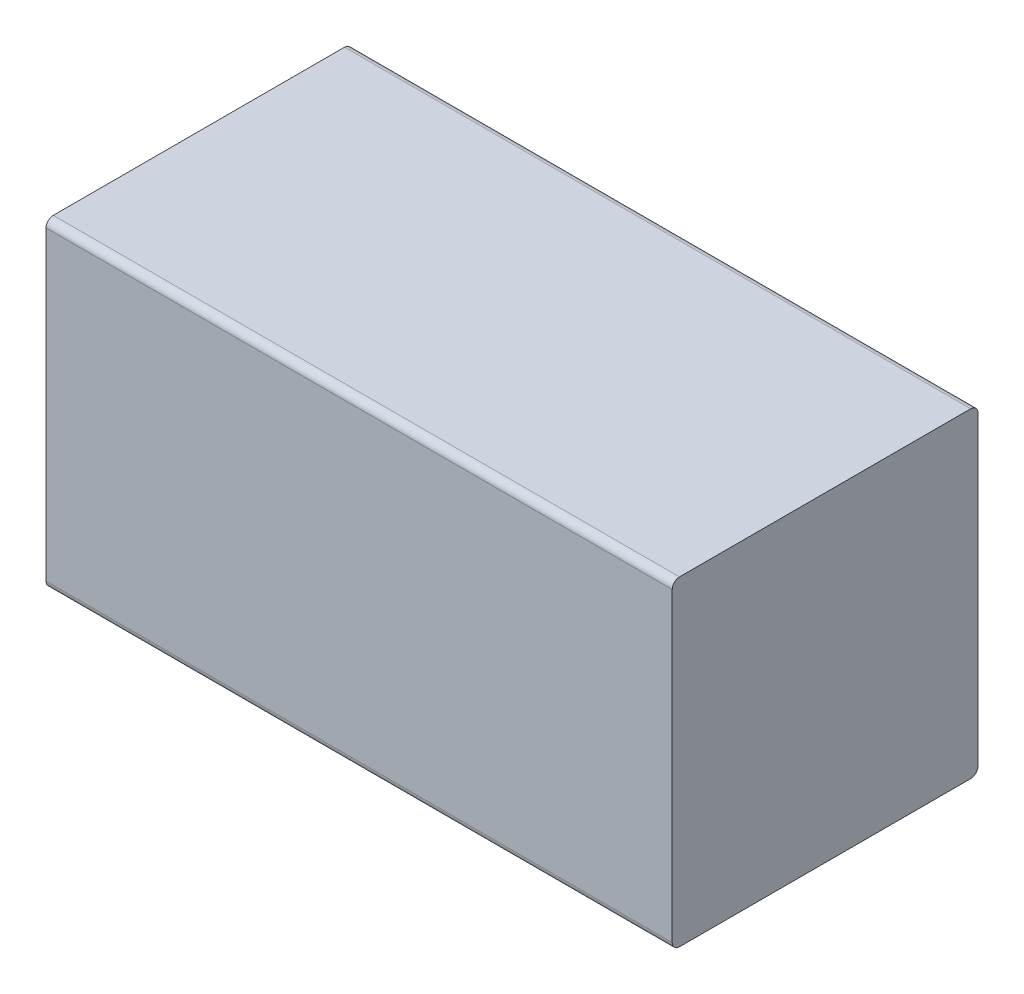
ISO-10303-21;
HEADER;
FILE_DESCRIPTION(('STEP AP214'),'2;1');
FILE_NAME('part.step','',(''),(''),'','','');
FILE_SCHEMA(('AUTOMOTIVE_DESIGN { 1 0 10303 214 1 1 1 1 }'));
ENDSEC;
DATA;
#1=APPLICATION_CONTEXT('core data for automotive mechanical design processes');
#2=APPLICATION_PROTOCOL_DEFINITION('international standard','automotive_design',2000,#1);
#3=PRODUCT_CONTEXT('',#1,'mechanical');
#4=PRODUCT('Part','Part','',(#3));
#5=PRODUCT_RELATED_PRODUCT_CATEGORY('part','',(#4));
#6=PRODUCT_DEFINITION_FORMATION('','',#4);
#7=PRODUCT_DEFINITION_CONTEXT('part definition',#1,'design');
#8=PRODUCT_DEFINITION('design','',#6,#7);
#9=PRODUCT_DEFINITION_SHAPE('','',#8);
#10=(LENGTH_UNIT() NAMED_UNIT(*) SI_UNIT(.MILLI.,.METRE.));
#11=(NAMED_UNIT(*) PLANE_ANGLE_UNIT() SI_UNIT($,.RADIAN.));
#12=(NAMED_UNIT(*) SI_UNIT($,.STERADIAN.) SOLID_ANGLE_UNIT());
#13=UNCERTAINTY_MEASURE_WITH_UNIT(LENGTH_MEASURE(1.E-05),#10,'distance_accuracy_value','');
#14=(GEOMETRIC_REPRESENTATION_CONTEXT(3) GLOBAL_UNCERTAINTY_ASSIGNED_CONTEXT((#13)) GLOBAL_UNIT_ASSIGNED_CONTEXT((#10,
#11,#12)) REPRESENTATION_CONTEXT('',''));
#15=CARTESIAN_POINT('',(0.,0.,0.));
#16=DIRECTION('',(0.,0.,1.));
#17=DIRECTION('',(1.,0.,0.));
#18=AXIS2_PLACEMENT_3D('',#15,#16,#17);
#19=CARTESIAN_POINT('',(2.15042,0.,2.66));
#20=DIRECTION('',(1.,0.,0.));
#21=DIRECTION('',(0.,1.,0.));
#22=AXIS2_PLACEMENT_3D('',#19,#20,#21);
#23=PLANE('',#22);
#24=DIRECTION('',(0.,0.,-1.));
#25=VECTOR('',#24,1.);
#26=CARTESIAN_POINT('',(2.15042,-1.1,3.66));
#27=LINE('',#26,#25);
#28=CARTESIAN_POINT('',(2.15042,-1.1,3.66));
#29=VERTEX_POINT('',#28);
#30=CARTESIAN_POINT('',(2.15042,-1.1,1.66));
#31=VERTEX_POINT('',#30);
#32=EDGE_CURVE('E163',#29,#31,#27,.T.);
#33=ORIENTED_EDGE('',*,*,#32,.T.);
#34=CARTESIAN_POINT('',(2.15042,-1.05,1.66));
#35=DIRECTION('',(1.,0.,0.));
#36=DIRECTION('',(0.,-1.,0.));
#37=AXIS2_PLACEMENT_3D('',#34,#35,#36);
#38=CIRCLE('',#37,0.05);
#39=CARTESIAN_POINT('',(2.15042,-1.05,1.61));
#40=VERTEX_POINT('',#39);
#41=EDGE_CURVE('E11',#31,#40,#38,.T.);
#42=ORIENTED_EDGE('',*,*,#41,.T.);
#43=DIRECTION('',(0.,1.,0.));
#44=VECTOR('',#43,1.);
#45=CARTESIAN_POINT('',(2.15042,-1.05,1.61));
#46=LINE('',#45,#44);
#47=CARTESIAN_POINT('',(2.15042,1.05,1.61));
#48=VERTEX_POINT('',#47);
#49=EDGE_CURVE('E27',#40,#48,#46,.T.);
#50=ORIENTED_EDGE('',*,*,#49,.T.);
#51=CARTESIAN_POINT('',(2.15042,1.05,1.66));
#52=DIRECTION('',(1.,0.,0.));
#53=DIRECTION('',(0.,0.,-1.));
#54=AXIS2_PLACEMENT_3D('',#51,#52,#53);
#55=CIRCLE('',#54,0.05);
#56=CARTESIAN_POINT('',(2.15042,1.1,1.66));
#57=VERTEX_POINT('',#56);
#58=EDGE_CURVE('E107',#48,#57,#55,.T.);
#59=ORIENTED_EDGE('',*,*,#58,.T.);
#60=DIRECTION('',(0.,0.,1.));
#61=VECTOR('',#60,1.);
#62=CARTESIAN_POINT('',(2.15042,1.1,1.66));
#63=LINE('',#62,#61);
#64=CARTESIAN_POINT('',(2.15042,1.1,3.66));
#65=VERTEX_POINT('',#64);
#66=EDGE_CURVE('E109',#57,#65,#63,.T.);
#67=ORIENTED_EDGE('',*,*,#66,.T.);
#68=CARTESIAN_POINT('',(2.15042,1.05,3.66));
#69=DIRECTION('',(1.,0.,0.));
#70=DIRECTION('',(0.,1.,0.));
#71=AXIS2_PLACEMENT_3D('',#68,#69,#70);
#72=CIRCLE('',#71,0.05);
#73=CARTESIAN_POINT('',(2.15042,1.05,3.71));
#74=VERTEX_POINT('',#73);
#75=EDGE_CURVE('E124',#65,#74,#72,.T.);
#76=ORIENTED_EDGE('',*,*,#75,.T.);
#77=DIRECTION('',(0.,-1.,0.));
#78=VECTOR('',#77,1.);
#79=CARTESIAN_POINT('',(2.15042,1.05,3.71));
#80=LINE('',#79,#78);
#81=CARTESIAN_POINT('',(2.15042,-1.05,3.71));
#82=VERTEX_POINT('',#81);
#83=EDGE_CURVE('E144',#74,#82,#80,.T.);
#84=ORIENTED_EDGE('',*,*,#83,.T.);
#85=CARTESIAN_POINT('',(2.15042,-1.05,3.66));
#86=DIRECTION('',(1.,0.,0.));
#87=DIRECTION('',(0.,0.,1.));
#88=AXIS2_PLACEMENT_3D('',#85,#86,#87);
#89=CIRCLE('',#88,0.05);
#90=EDGE_CURVE('E148',#82,#29,#89,.T.);
#91=ORIENTED_EDGE('',*,*,#90,.T.);
#92=EDGE_LOOP('',(#33,#42,#50,#59,#67,#76,#84,#91));
#93=FACE_BOUND('',#92,.T.);
#94=ADVANCED_FACE('F16',(#93),#23,.T.);
#95=CARTESIAN_POINT('',(0.,-1.05,1.66));
#96=DIRECTION('',(-1.,0.,0.));
#97=DIRECTION('',(0.,-1.,0.));
#98=AXIS2_PLACEMENT_3D('',#95,#96,#97);
#99=CYLINDRICAL_SURFACE('',#98,0.05);
#100=DIRECTION('',(1.,0.,0.));
#101=VECTOR('',#100,1.);
#102=CARTESIAN_POINT('',(0.,-1.1,1.66));
#103=LINE('',#102,#101);
#104=CARTESIAN_POINT('',(-2.15042,-1.1,1.66));
#105=VERTEX_POINT('',#104);
#106=EDGE_CURVE('E159',#105,#31,#103,.T.);
#107=ORIENTED_EDGE('',*,*,#106,.F.);
#108=CARTESIAN_POINT('',(-2.15042,-1.05,1.66));
#109=DIRECTION('',(-1.,0.,0.));
#110=DIRECTION('',(0.,-1.,0.));
#111=AXIS2_PLACEMENT_3D('',#108,#109,#110);
#112=CIRCLE('',#111,0.05);
#113=CARTESIAN_POINT('',(-2.15042,-1.05,1.61));
#114=VERTEX_POINT('',#113);
#115=EDGE_CURVE('E20',#114,#105,#112,.T.);
#116=ORIENTED_EDGE('',*,*,#115,.F.);
#117=DIRECTION('',(1.,0.,0.));
#118=VECTOR('',#117,1.);
#119=CARTESIAN_POINT('',(0.,-1.05,1.61));
#120=LINE('',#119,#118);
#121=EDGE_CURVE('E112',#114,#40,#120,.T.);
#122=ORIENTED_EDGE('',*,*,#121,.T.);
#123=ORIENTED_EDGE('',*,*,#41,.F.);
#124=EDGE_LOOP('',(#107,#116,#122,#123));
#125=FACE_BOUND('',#124,.T.);
#126=ADVANCED_FACE('F341',(#125),#99,.T.);
#127=CARTESIAN_POINT('',(0.,1.05,1.61));
#128=DIRECTION('',(0.,0.,-1.));
#129=DIRECTION('',(0.,-1.,0.));
#130=AXIS2_PLACEMENT_3D('',#127,#128,#129);
#131=PLANE('',#130);
#132=ORIENTED_EDGE('',*,*,#121,.F.);
#133=DIRECTION('',(0.,-1.,0.));
#134=VECTOR('',#133,1.);
#135=CARTESIAN_POINT('',(-2.15042,-1.05,1.61));
#136=LINE('',#135,#134);
#137=CARTESIAN_POINT('',(-2.15042,1.05,1.61));
#138=VERTEX_POINT('',#137);
#139=EDGE_CURVE('E137',#138,#114,#136,.T.);
#140=ORIENTED_EDGE('',*,*,#139,.F.);
#141=DIRECTION('',(1.,0.,0.));
#142=VECTOR('',#141,1.);
#143=CARTESIAN_POINT('',(0.,1.05,1.61));
#144=LINE('',#143,#142);
#145=EDGE_CURVE('E63',#138,#48,#144,.T.);
#146=ORIENTED_EDGE('',*,*,#145,.T.);
#147=ORIENTED_EDGE('',*,*,#49,.F.);
#148=EDGE_LOOP('',(#132,#140,#146,#147));
#149=FACE_BOUND('',#148,.T.);
#150=ADVANCED_FACE('F175',(#149),#131,.T.);
#151=CARTESIAN_POINT('',(0.,1.05,1.66));
#152=DIRECTION('',(-1.,0.,0.));
#153=DIRECTION('',(0.,0.,-1.));
#154=AXIS2_PLACEMENT_3D('',#151,#152,#153);
#155=CYLINDRICAL_SURFACE('',#154,0.05);
#156=ORIENTED_EDGE('',*,*,#145,.F.);
#157=CARTESIAN_POINT('',(-2.15042,1.05,1.66));
#158=DIRECTION('',(-1.,0.,0.));
#159=DIRECTION('',(0.,0.,-1.));
#160=AXIS2_PLACEMENT_3D('',#157,#158,#159);
#161=CIRCLE('',#160,0.05);
#162=CARTESIAN_POINT('',(-2.15042,1.1,1.66));
#163=VERTEX_POINT('',#162);
#164=EDGE_CURVE('E121',#163,#138,#161,.T.);
#165=ORIENTED_EDGE('',*,*,#164,.F.);
#166=DIRECTION('',(1.,0.,0.));
#167=VECTOR('',#166,1.);
#168=CARTESIAN_POINT('',(0.,1.1,1.66));
#169=LINE('',#168,#167);
#170=EDGE_CURVE('E80',#163,#57,#169,.T.);
#171=ORIENTED_EDGE('',*,*,#170,.T.);
#172=ORIENTED_EDGE('',*,*,#58,.F.);
#173=EDGE_LOOP('',(#156,#165,#171,#172));
#174=FACE_BOUND('',#173,.T.);
#175=ADVANCED_FACE('F119',(#174),#155,.T.);
#176=CARTESIAN_POINT('',(0.,1.1,3.66));
#177=DIRECTION('',(0.,1.,0.));
#178=DIRECTION('',(1.,0.,0.));
#179=AXIS2_PLACEMENT_3D('',#176,#177,#178);
#180=PLANE('',#179);
#181=ORIENTED_EDGE('',*,*,#170,.F.);
#182=DIRECTION('',(0.,0.,-1.));
#183=VECTOR('',#182,1.);
#184=CARTESIAN_POINT('',(-2.15042,1.1,1.66));
#185=LINE('',#184,#183);
#186=CARTESIAN_POINT('',(-2.15042,1.1,3.66));
#187=VERTEX_POINT('',#186);
#188=EDGE_CURVE('E138',#187,#163,#185,.T.);
#189=ORIENTED_EDGE('',*,*,#188,.F.);
#190=DIRECTION('',(1.,0.,0.));
#191=VECTOR('',#190,1.);
#192=CARTESIAN_POINT('',(0.,1.1,3.66));
#193=LINE('',#192,#191);
#194=EDGE_CURVE('E116',#187,#65,#193,.T.);
#195=ORIENTED_EDGE('',*,*,#194,.T.);
#196=ORIENTED_EDGE('',*,*,#66,.F.);
#197=EDGE_LOOP('',(#181,#189,#195,#196));
#198=FACE_BOUND('',#197,.T.);
#199=ADVANCED_FACE('F115',(#198),#180,.T.);
#200=CARTESIAN_POINT('',(0.,1.05,3.66));
#201=DIRECTION('',(-1.,0.,0.));
#202=DIRECTION('',(0.,1.,0.));
#203=AXIS2_PLACEMENT_3D('',#200,#201,#202);
#204=CYLINDRICAL_SURFACE('',#203,0.05);
#205=ORIENTED_EDGE('',*,*,#194,.F.);
#206=CARTESIAN_POINT('',(-2.15042,1.05,3.66));
#207=DIRECTION('',(-1.,0.,0.));
#208=DIRECTION('',(0.,1.,0.));
#209=AXIS2_PLACEMENT_3D('',#206,#207,#208);
#210=CIRCLE('',#209,0.05);
#211=CARTESIAN_POINT('',(-2.15042,1.05,3.71));
#212=VERTEX_POINT('',#211);
#213=EDGE_CURVE('E157',#212,#187,#210,.T.);
#214=ORIENTED_EDGE('',*,*,#213,.F.);
#215=DIRECTION('',(1.,0.,0.));
#216=VECTOR('',#215,1.);
#217=CARTESIAN_POINT('',(0.,1.05,3.71));
#218=LINE('',#217,#216);
#219=EDGE_CURVE('E147',#212,#74,#218,.T.);
#220=ORIENTED_EDGE('',*,*,#219,.T.);
#221=ORIENTED_EDGE('',*,*,#75,.F.);
#222=EDGE_LOOP('',(#205,#214,#220,#221));
#223=FACE_BOUND('',#222,.T.);
#224=ADVANCED_FACE('F324',(#223),#204,.T.);
#225=CARTESIAN_POINT('',(0.,-1.05,3.71));
#226=DIRECTION('',(0.,0.,1.));
#227=DIRECTION('',(1.,0.,0.));
#228=AXIS2_PLACEMENT_3D('',#225,#226,#227);
#229=PLANE('',#228);
#230=ORIENTED_EDGE('',*,*,#219,.F.);
#231=DIRECTION('',(0.,1.,0.));
#232=VECTOR('',#231,1.);
#233=CARTESIAN_POINT('',(-2.15042,1.05,3.71));
#234=LINE('',#233,#232);
#235=CARTESIAN_POINT('',(-2.15042,-1.05,3.71));
#236=VERTEX_POINT('',#235);
#237=EDGE_CURVE('E153',#236,#212,#234,.T.);
#238=ORIENTED_EDGE('',*,*,#237,.F.);
#239=DIRECTION('',(1.,0.,0.));
#240=VECTOR('',#239,1.);
#241=CARTESIAN_POINT('',(0.,-1.05,3.71));
#242=LINE('',#241,#240);
#243=EDGE_CURVE('E151',#236,#82,#242,.T.);
#244=ORIENTED_EDGE('',*,*,#243,.T.);
#245=ORIENTED_EDGE('',*,*,#83,.F.);
#246=EDGE_LOOP('',(#230,#238,#244,#245));
#247=FACE_BOUND('',#246,.T.);
#248=ADVANCED_FACE('F329',(#247),#229,.T.);
#249=CARTESIAN_POINT('',(0.,-1.05,3.66));
#250=DIRECTION('',(-1.,0.,0.));
#251=DIRECTION('',(0.,0.,1.));
#252=AXIS2_PLACEMENT_3D('',#249,#250,#251);
#253=CYLINDRICAL_SURFACE('',#252,0.05);
#254=ORIENTED_EDGE('',*,*,#243,.F.);
#255=CARTESIAN_POINT('',(-2.15042,-1.05,3.66));
#256=DIRECTION('',(-1.,0.,0.));
#257=DIRECTION('',(0.,0.,1.));
#258=AXIS2_PLACEMENT_3D('',#255,#256,#257);
#259=CIRCLE('',#258,0.05);
#260=CARTESIAN_POINT('',(-2.15042,-1.1,3.66));
#261=VERTEX_POINT('',#260);
#262=EDGE_CURVE('E158',#261,#236,#259,.T.);
#263=ORIENTED_EDGE('',*,*,#262,.F.);
#264=DIRECTION('',(-1.,0.,0.));
#265=VECTOR('',#264,1.);
#266=CARTESIAN_POINT('',(0.,-1.1,3.66));
#267=LINE('',#266,#265);
#268=EDGE_CURVE('E164',#29,#261,#267,.T.);
#269=ORIENTED_EDGE('',*,*,#268,.F.);
#270=ORIENTED_EDGE('',*,*,#90,.F.);
#271=EDGE_LOOP('',(#254,#263,#269,#270));
#272=FACE_BOUND('',#271,.T.);
#273=ADVANCED_FACE('F18',(#272),#253,.T.);
#274=CARTESIAN_POINT('',(0.,-1.1,1.66));
#275=DIRECTION('',(0.,-1.,0.));
#276=DIRECTION('',(0.,0.,-1.));
#277=AXIS2_PLACEMENT_3D('',#274,#275,#276);
#278=PLANE('',#277);
#279=ORIENTED_EDGE('',*,*,#268,.T.);
#280=DIRECTION('',(0.,0.,1.));
#281=VECTOR('',#280,1.);
#282=CARTESIAN_POINT('',(-2.15042,-1.1,3.66));
#283=LINE('',#282,#281);
#284=EDGE_CURVE('E133',#105,#261,#283,.T.);
#285=ORIENTED_EDGE('',*,*,#284,.F.);
#286=ORIENTED_EDGE('',*,*,#106,.T.);
#287=ORIENTED_EDGE('',*,*,#32,.F.);
#288=EDGE_LOOP('',(#279,#285,#286,#287));
#289=FACE_BOUND('',#288,.T.);
#290=ADVANCED_FACE('F212',(#289),#278,.T.);
#291=CARTESIAN_POINT('',(-2.15042,0.,2.66));
#292=DIRECTION('',(1.,0.,0.));
#293=DIRECTION('',(0.,1.,0.));
#294=AXIS2_PLACEMENT_3D('',#291,#292,#293);
#295=PLANE('',#294);
#296=ORIENTED_EDGE('',*,*,#284,.T.);
#297=ORIENTED_EDGE('',*,*,#262,.T.);
#298=ORIENTED_EDGE('',*,*,#237,.T.);
#299=ORIENTED_EDGE('',*,*,#213,.T.);
#300=ORIENTED_EDGE('',*,*,#188,.T.);
#301=ORIENTED_EDGE('',*,*,#164,.T.);
#302=ORIENTED_EDGE('',*,*,#139,.T.);
#303=ORIENTED_EDGE('',*,*,#115,.T.);
#304=EDGE_LOOP('',(#296,#297,#298,#299,#300,#301,#302,#303));
#305=FACE_BOUND('',#304,.T.);
#306=ADVANCED_FACE('F183',(#305),#295,.F.);
#307=CLOSED_SHELL('',(#94,#126,#150,#175,#199,#224,#248,#273,#290,#306));
#308=MANIFOLD_SOLID_BREP('B1',#307);
#309=ADVANCED_BREP_SHAPE_REPRESENTATION('',(#18,#308),#14);
#310=SHAPE_DEFINITION_REPRESENTATION(#9,#309);
ENDSEC;
END-ISO-10303-21;
